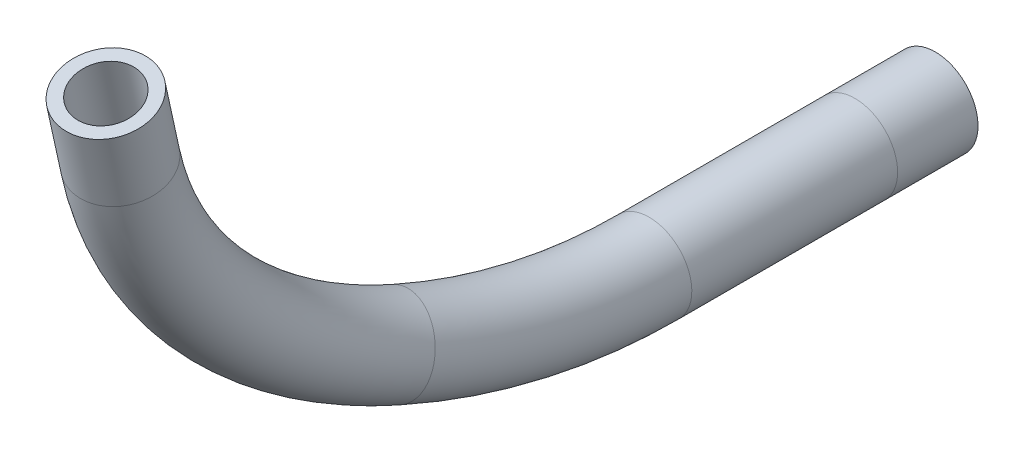
ISO-10303-21;
HEADER;
FILE_DESCRIPTION(('STEP AP214'),'2;1');
FILE_NAME('part.step','',(''),(''),'','','');
FILE_SCHEMA(('AUTOMOTIVE_DESIGN { 1 0 10303 214 1 1 1 1 }'));
ENDSEC;
DATA;
#1=APPLICATION_CONTEXT('core data for automotive mechanical design processes');
#2=APPLICATION_PROTOCOL_DEFINITION('international standard','automotive_design',2000,#1);
#3=PRODUCT_CONTEXT('',#1,'mechanical');
#4=PRODUCT('Part','Part','',(#3));
#5=PRODUCT_RELATED_PRODUCT_CATEGORY('part','',(#4));
#6=PRODUCT_DEFINITION_FORMATION('','',#4);
#7=PRODUCT_DEFINITION_CONTEXT('part definition',#1,'design');
#8=PRODUCT_DEFINITION('design','',#6,#7);
#9=PRODUCT_DEFINITION_SHAPE('','',#8);
#10=(LENGTH_UNIT() NAMED_UNIT(*) SI_UNIT(.MILLI.,.METRE.));
#11=(NAMED_UNIT(*) PLANE_ANGLE_UNIT() SI_UNIT($,.RADIAN.));
#12=(NAMED_UNIT(*) SI_UNIT($,.STERADIAN.) SOLID_ANGLE_UNIT());
#13=UNCERTAINTY_MEASURE_WITH_UNIT(LENGTH_MEASURE(1.E-05),#10,'distance_accuracy_value','');
#14=(GEOMETRIC_REPRESENTATION_CONTEXT(3) GLOBAL_UNCERTAINTY_ASSIGNED_CONTEXT((#13)) GLOBAL_UNIT_ASSIGNED_CONTEXT((#10,
#11,#12)) REPRESENTATION_CONTEXT('',''));
#15=CARTESIAN_POINT('',(0.,0.,0.));
#16=DIRECTION('',(0.,0.,1.));
#17=DIRECTION('',(1.,0.,0.));
#18=AXIS2_PLACEMENT_3D('',#15,#16,#17);
#19=CARTESIAN_POINT('',(-10.1493988362336,122.94882282542,226.479981937185));
#20=DIRECTION('',(-0.0674898899338369,-0.962361607918607,-0.263258903669053));
#21=DIRECTION('',(0.,0.263860516707443,-0.964560847081656));
#22=AXIS2_PLACEMENT_3D('',#19,#20,#21);
#23=PLANE('',#22);
#24=CARTESIAN_POINT('',(-10.1493988362329,122.948822825423,226.479981937173));
#25=DIRECTION('',(-0.0674898899338369,-0.962361607918607,-0.263258903669053));
#26=DIRECTION('',(0.,0.263860516707443,-0.964560847081656));
#27=AXIS2_PLACEMENT_3D('',#24,#25,#26);
#28=CIRCLE('',#27,9.525);
#29=CARTESIAN_POINT('',(-10.1493988362329,125.462094247061,217.292539868721));
#30=VERTEX_POINT('',#29);
#31=EDGE_CURVE('E93',#30,#30,#28,.F.);
#32=ORIENTED_EDGE('',*,*,#31,.F.);
#33=EDGE_LOOP('',(#32));
#34=FACE_BOUND('',#33,.T.);
#35=CARTESIAN_POINT('',(-10.1493988362336,122.94882282542,226.479981937185));
#36=DIRECTION('',(-0.0674898899338369,-0.962361607918607,-0.263258903669053));
#37=DIRECTION('',(0.,0.263860516707443,-0.964560847081656));
#38=AXIS2_PLACEMENT_3D('',#35,#36,#37);
#39=CIRCLE('',#38,13.49375);
#40=CARTESIAN_POINT('',(-10.1493988362336,126.509290672741,213.464439006877));
#41=VERTEX_POINT('',#40);
#42=EDGE_CURVE('E89',#41,#41,#39,.T.);
#43=ORIENTED_EDGE('',*,*,#42,.F.);
#44=EDGE_LOOP('',(#43));
#45=FACE_BOUND('',#44,.T.);
#46=ADVANCED_FACE('F60',(#34,#45),#23,.F.);
#47=CARTESIAN_POINT('',(0.,0.,-25.4));
#48=DIRECTION('',(0.,0.,-1.));
#49=DIRECTION('',(-0.0717543926102708,0.997422331382816,0.));
#50=AXIS2_PLACEMENT_3D('',#47,#48,#49);
#51=PLANE('',#50);
#52=CARTESIAN_POINT('',(0.,0.,-25.4));
#53=DIRECTION('',(0.,0.,-1.));
#54=DIRECTION('',(0.,1.,0.));
#55=AXIS2_PLACEMENT_3D('',#52,#53,#54);
#56=CIRCLE('',#55,9.525);
#57=CARTESIAN_POINT('',(0.,9.52500000000003,-25.4));
#58=VERTEX_POINT('',#57);
#59=EDGE_CURVE('E94',#58,#58,#56,.F.);
#60=ORIENTED_EDGE('',*,*,#59,.T.);
#61=EDGE_LOOP('',(#60));
#62=FACE_BOUND('',#61,.T.);
#63=CARTESIAN_POINT('',(0.,0.,-25.4));
#64=DIRECTION('',(0.,0.,-1.));
#65=DIRECTION('',(-0.0717543926102708,0.997422331382816,0.));
#66=AXIS2_PLACEMENT_3D('',#63,#64,#65);
#67=CIRCLE('',#66,13.49375);
#68=CARTESIAN_POINT('',(-0.968235835284846,13.4589675840968,-25.4));
#69=VERTEX_POINT('',#68);
#70=EDGE_CURVE('E11',#69,#69,#67,.T.);
#71=ORIENTED_EDGE('',*,*,#70,.T.);
#72=EDGE_LOOP('',(#71));
#73=FACE_BOUND('',#72,.T.);
#74=ADVANCED_FACE('F124',(#62,#73),#51,.T.);
#75=CARTESIAN_POINT('',(-10.1493988362336,122.94882282542,226.479981937185));
#76=DIRECTION('',(-0.067489889933837,-0.962361607918607,-0.263258903669051));
#77=DIRECTION('',(0.,0.263860516707442,-0.964560847081656));
#78=AXIS2_PLACEMENT_3D('',#75,#76,#77);
#79=CYLINDRICAL_SURFACE('',#78,13.49375);
#80=CARTESIAN_POINT('',(-11.705580718328,100.758688870033,220.409758136384));
#81=DIRECTION('',(-0.0674898899338369,-0.962361607918607,-0.263258903669053));
#82=DIRECTION('',(0.,0.263860516707443,-0.964560847081656));
#83=AXIS2_PLACEMENT_3D('',#80,#81,#82);
#84=CIRCLE('',#83,13.49375);
#85=CARTESIAN_POINT('',(-14.7891246389748,97.4940593792361,233.134350084253));
#86=VERTEX_POINT('',#85);
#87=EDGE_CURVE('E85',#86,#86,#84,.T.);
#88=ORIENTED_EDGE('',*,*,#87,.F.);
#89=EDGE_LOOP('',(#88));
#90=FACE_BOUND('',#89,.T.);
#91=ORIENTED_EDGE('',*,*,#42,.T.);
#92=EDGE_LOOP('',(#91));
#93=FACE_BOUND('',#92,.T.);
#94=ADVANCED_FACE('F128',(#90,#93),#79,.T.);
#95=CARTESIAN_POINT('',(17.3160091230527,131.484613489293,100.648892744679));
#96=DIRECTION('',(0.971197891445433,-0.123801886205056,0.20358720152312));
#97=DIRECTION('',(0.205165549323341,0.,-0.978727284472468));
#98=AXIS2_PLACEMENT_3D('',#95,#96,#97);
#99=TOROIDAL_SURFACE('',#98,127.,13.49375);
#100=CARTESIAN_POINT('',(-5.8645703689163,12.6408205202059,138.96094838174));
#101=DIRECTION('',(0.153165121863844,-0.330140605985105,-0.931422366987299));
#102=DIRECTION('',(-0.0447696115141744,0.939257836261269,-0.340279883194217));
#103=AXIS2_PLACEMENT_3D('',#100,#101,#102);
#104=CIRCLE('',#103,13.49375);
#105=CARTESIAN_POINT('',(-8.32750693993806,0.0136675172400791,143.031604293178));
#106=VERTEX_POINT('',#105);
#107=EDGE_CURVE('E79',#106,#106,#104,.T.);
#108=CARTESIAN_POINT('',(17.3160091230527,131.484613489293,100.648892744679));
#109=DIRECTION('',(0.971197891445433,-0.123801886205056,0.20358720152312));
#110=DIRECTION('',(0.205165549323341,0.,-0.978727284472468));
#111=AXIS2_PLACEMENT_3D('',#108,#109,#110);
#112=CIRCLE('',#111,140.49375);
#113=EDGE_CURVE('',#86,#106,#112,.T.);
#114=ORIENTED_EDGE('',*,*,#87,.T.);
#115=ORIENTED_EDGE('',*,*,#107,.F.);
#116=ORIENTED_EDGE('',*,*,#113,.T.);
#117=ORIENTED_EDGE('',*,*,#113,.F.);
#118=EDGE_LOOP('',(#114,#116,#115,#117));
#119=FACE_BOUND('',#118,.T.);
#120=ADVANCED_FACE('F130',(#119),#99,.T.);
#121=CARTESIAN_POINT('',(-85.5172468234657,184.328620934825,65.0083262347418));
#122=DIRECTION('',(0.907129040033588,0.420852592635165,0.));
#123=DIRECTION('',(-0.420852592635165,0.907129040033588,0.));
#124=AXIS2_PLACEMENT_3D('',#121,#122,#123);
#125=TOROIDAL_SURFACE('',#124,203.2,13.49375);
#126=CARTESIAN_POINT('',(0.,0.,65.0083262347418));
#127=DIRECTION('',(0.,0.,-1.));
#128=DIRECTION('',(-0.0717543926102708,0.997422331382816,0.));
#129=AXIS2_PLACEMENT_3D('',#126,#127,#128);
#130=CIRCLE('',#129,13.49375);
#131=CARTESIAN_POINT('',(-0.968235835284918,13.4589675840968,65.0083262347418));
#132=VERTEX_POINT('',#131);
#133=EDGE_CURVE('E73',#132,#132,#130,.T.);
#134=ORIENTED_EDGE('',*,*,#133,.F.);
#135=EDGE_LOOP('',(#134));
#136=FACE_BOUND('',#135,.T.);
#137=ORIENTED_EDGE('',*,*,#107,.T.);
#138=EDGE_LOOP('',(#137));
#139=FACE_BOUND('',#138,.T.);
#140=ADVANCED_FACE('F137',(#136,#139),#125,.T.);
#141=CARTESIAN_POINT('',(0.,0.,65.0083262347418));
#142=DIRECTION('',(0.,0.,-1.));
#143=DIRECTION('',(-1.,0.,0.));
#144=AXIS2_PLACEMENT_3D('',#141,#142,#143);
#145=CYLINDRICAL_SURFACE('',#144,13.49375);
#146=CARTESIAN_POINT('',(0.,0.,0.));
#147=DIRECTION('',(0.,0.,-1.));
#148=DIRECTION('',(-0.0717543926102708,0.997422331382816,0.));
#149=AXIS2_PLACEMENT_3D('',#146,#147,#148);
#150=CIRCLE('',#149,13.49375);
#151=CARTESIAN_POINT('',(-0.968235835284846,13.4589675840968,0.));
#152=VERTEX_POINT('',#151);
#153=EDGE_CURVE('E67',#152,#152,#150,.T.);
#154=ORIENTED_EDGE('',*,*,#153,.F.);
#155=EDGE_LOOP('',(#154));
#156=FACE_BOUND('',#155,.T.);
#157=ORIENTED_EDGE('',*,*,#133,.T.);
#158=EDGE_LOOP('',(#157));
#159=FACE_BOUND('',#158,.T.);
#160=ADVANCED_FACE('F145',(#156,#159),#145,.T.);
#161=CARTESIAN_POINT('',(0.,0.,0.));
#162=DIRECTION('',(0.,0.,-1.));
#163=DIRECTION('',(-1.,0.,0.));
#164=AXIS2_PLACEMENT_3D('',#161,#162,#163);
#165=CYLINDRICAL_SURFACE('',#164,13.49375);
#166=ORIENTED_EDGE('',*,*,#70,.F.);
#167=EDGE_LOOP('',(#166));
#168=FACE_BOUND('',#167,.T.);
#169=ORIENTED_EDGE('',*,*,#153,.T.);
#170=EDGE_LOOP('',(#169));
#171=FACE_BOUND('',#170,.T.);
#172=ADVANCED_FACE('F143',(#168,#171),#165,.T.);
#173=CARTESIAN_POINT('',(0.,0.,0.));
#174=DIRECTION('',(0.,0.,-1.));
#175=DIRECTION('',(-1.,0.,0.));
#176=AXIS2_PLACEMENT_3D('',#173,#174,#175);
#177=CYLINDRICAL_SURFACE('',#176,9.525);
#178=CARTESIAN_POINT('',(0.,0.,0.));
#179=DIRECTION('',(0.,0.,-1.));
#180=DIRECTION('',(-0.0717543926102708,0.997422331382816,0.));
#181=AXIS2_PLACEMENT_3D('',#178,#179,#180);
#182=CIRCLE('',#181,9.525);
#183=CARTESIAN_POINT('',(-0.683460589612833,9.50044770642135,4.50489645587027E-13));
#184=VERTEX_POINT('',#183);
#185=EDGE_CURVE('E99',#184,#184,#182,.T.);
#186=ORIENTED_EDGE('',*,*,#185,.F.);
#187=EDGE_LOOP('',(#186));
#188=FACE_BOUND('',#187,.T.);
#189=ORIENTED_EDGE('',*,*,#59,.F.);
#190=EDGE_LOOP('',(#189));
#191=FACE_BOUND('',#190,.T.);
#192=ADVANCED_FACE('F125',(#188,#191),#177,.F.);
#193=CARTESIAN_POINT('',(-10.0819089462983,123.911184433352,226.743240840845));
#194=DIRECTION('',(-0.067489889933837,-0.962361607918607,-0.263258903669052));
#195=DIRECTION('',(0.,0.263860516707442,-0.964560847081656));
#196=AXIS2_PLACEMENT_3D('',#193,#194,#195);
#197=CYLINDRICAL_SURFACE('',#196,9.525);
#198=ORIENTED_EDGE('',*,*,#31,.T.);
#199=EDGE_LOOP('',(#198));
#200=FACE_BOUND('',#199,.T.);
#201=CARTESIAN_POINT('',(-11.7055807183267,100.758688870043,220.409758136379));
#202=DIRECTION('',(-0.0674898899338369,-0.962361607918607,-0.263258903669053));
#203=DIRECTION('',(0.,0.263860516707443,-0.964560847081656));
#204=AXIS2_PLACEMENT_3D('',#201,#202,#203);
#205=CIRCLE('',#204,9.525);
#206=CARTESIAN_POINT('',(-13.8821999564304,98.4542445235993,229.391823040757));
#207=VERTEX_POINT('',#206);
#208=EDGE_CURVE('E98',#207,#207,#205,.T.);
#209=ORIENTED_EDGE('',*,*,#208,.T.);
#210=EDGE_LOOP('',(#209));
#211=FACE_BOUND('',#210,.T.);
#212=ADVANCED_FACE('F119',(#200,#211),#197,.F.);
#213=CARTESIAN_POINT('',(17.3160091230515,131.484613489293,100.648892744679));
#214=DIRECTION('',(0.971197891445433,-0.123801886205056,0.20358720152312));
#215=DIRECTION('',(0.205165549323341,0.,-0.978727284472468));
#216=AXIS2_PLACEMENT_3D('',#213,#214,#215);
#217=TOROIDAL_SURFACE('',#216,126.999999999992,9.525);
#218=CARTESIAN_POINT('',(-5.86457036891629,12.6408205202059,138.96094838174));
#219=DIRECTION('',(0.153165121863846,-0.330140605985061,-0.931422366987314));
#220=DIRECTION('',(-0.0447696115141815,0.939257836261284,-0.340279883194174));
#221=AXIS2_PLACEMENT_3D('',#218,#219,#220);
#222=CIRCLE('',#221,9.525);
#223=CARTESIAN_POINT('',(-7.60311383081245,3.72753604753165,141.834352554518));
#224=VERTEX_POINT('',#223);
#225=EDGE_CURVE('E103',#224,#224,#222,.T.);
#226=CARTESIAN_POINT('',(17.3160091230515,131.484613489293,100.648892744679));
#227=DIRECTION('',(0.971197891445433,-0.123801886205056,0.20358720152312));
#228=DIRECTION('',(0.205165549323341,0.,-0.978727284472468));
#229=AXIS2_PLACEMENT_3D('',#226,#227,#228);
#230=CIRCLE('',#229,136.524999999992);
#231=EDGE_CURVE('',#207,#224,#230,.T.);
#232=ORIENTED_EDGE('',*,*,#208,.F.);
#233=ORIENTED_EDGE('',*,*,#225,.T.);
#234=ORIENTED_EDGE('',*,*,#231,.T.);
#235=ORIENTED_EDGE('',*,*,#231,.F.);
#236=EDGE_LOOP('',(#232,#234,#233,#235));
#237=FACE_BOUND('',#236,.T.);
#238=ADVANCED_FACE('F193',(#237),#217,.F.);
#239=CARTESIAN_POINT('',(-85.5172468234657,184.328620934825,65.0083262347418));
#240=DIRECTION('',(0.907129040033588,0.420852592635165,0.));
#241=DIRECTION('',(-0.420852592635165,0.907129040033588,0.));
#242=AXIS2_PLACEMENT_3D('',#239,#240,#241);
#243=TOROIDAL_SURFACE('',#242,203.2,9.525);
#244=CARTESIAN_POINT('',(0.,0.,65.0083262347418));
#245=DIRECTION('',(0.,0.,-1.));
#246=DIRECTION('',(-0.0717543926102708,0.997422331382816,0.));
#247=AXIS2_PLACEMENT_3D('',#244,#245,#246);
#248=CIRCLE('',#247,9.525);
#249=CARTESIAN_POINT('',(-0.683460589612906,9.50044770642132,65.0083262347422));
#250=VERTEX_POINT('',#249);
#251=EDGE_CURVE('E107',#250,#250,#248,.T.);
#252=ORIENTED_EDGE('',*,*,#251,.T.);
#253=EDGE_LOOP('',(#252));
#254=FACE_BOUND('',#253,.T.);
#255=ORIENTED_EDGE('',*,*,#225,.F.);
#256=EDGE_LOOP('',(#255));
#257=FACE_BOUND('',#256,.T.);
#258=ADVANCED_FACE('F202',(#254,#257),#243,.F.);
#259=CARTESIAN_POINT('',(0.,0.,65.0083262347418));
#260=DIRECTION('',(0.,0.,-1.));
#261=DIRECTION('',(-1.,0.,0.));
#262=AXIS2_PLACEMENT_3D('',#259,#260,#261);
#263=CYLINDRICAL_SURFACE('',#262,9.525);
#264=ORIENTED_EDGE('',*,*,#185,.T.);
#265=EDGE_LOOP('',(#264));
#266=FACE_BOUND('',#265,.T.);
#267=ORIENTED_EDGE('',*,*,#251,.F.);
#268=EDGE_LOOP('',(#267));
#269=FACE_BOUND('',#268,.T.);
#270=ADVANCED_FACE('F153',(#266,#269),#263,.F.);
#271=CLOSED_SHELL('',(#46,#74,#94,#120,#140,#160,#172,#192,#212,#238,#258,#270));
#272=MANIFOLD_SOLID_BREP('B2',#271);
#273=ADVANCED_BREP_SHAPE_REPRESENTATION('',(#18,#272),#14);
#274=SHAPE_DEFINITION_REPRESENTATION(#9,#273);
ENDSEC;
END-ISO-10303-21;
